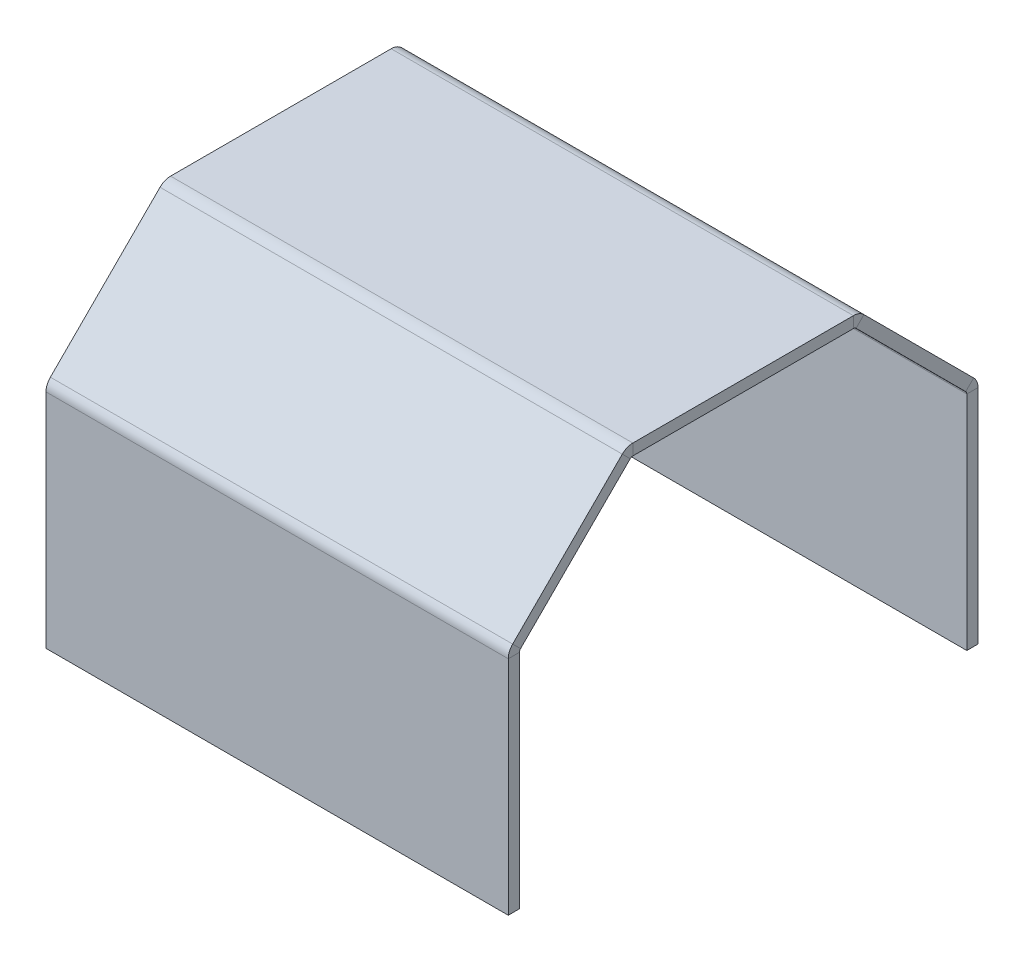
ISO-10303-21;
HEADER;
FILE_DESCRIPTION(('STEP AP214'),'2;1');
FILE_NAME('part.step','',(''),(''),'','','');
FILE_SCHEMA(('AUTOMOTIVE_DESIGN { 1 0 10303 214 1 1 1 1 }'));
ENDSEC;
DATA;
#1=APPLICATION_CONTEXT('core data for automotive mechanical design processes');
#2=APPLICATION_PROTOCOL_DEFINITION('international standard','automotive_design',2000,#1);
#3=PRODUCT_CONTEXT('',#1,'mechanical');
#4=PRODUCT('Part','Part','',(#3));
#5=PRODUCT_RELATED_PRODUCT_CATEGORY('part','',(#4));
#6=PRODUCT_DEFINITION_FORMATION('','',#4);
#7=PRODUCT_DEFINITION_CONTEXT('part definition',#1,'design');
#8=PRODUCT_DEFINITION('design','',#6,#7);
#9=PRODUCT_DEFINITION_SHAPE('','',#8);
#10=(LENGTH_UNIT() NAMED_UNIT(*) SI_UNIT(.MILLI.,.METRE.));
#11=(NAMED_UNIT(*) PLANE_ANGLE_UNIT() SI_UNIT($,.RADIAN.));
#12=(NAMED_UNIT(*) SI_UNIT($,.STERADIAN.) SOLID_ANGLE_UNIT());
#13=UNCERTAINTY_MEASURE_WITH_UNIT(LENGTH_MEASURE(1.E-05),#10,'distance_accuracy_value','');
#14=(GEOMETRIC_REPRESENTATION_CONTEXT(3) GLOBAL_UNCERTAINTY_ASSIGNED_CONTEXT((#13)) GLOBAL_UNIT_ASSIGNED_CONTEXT((#10,
#11,#12)) REPRESENTATION_CONTEXT('',''));
#15=CARTESIAN_POINT('',(0.,0.,0.));
#16=DIRECTION('',(0.,0.,1.));
#17=DIRECTION('',(1.,0.,0.));
#18=AXIS2_PLACEMENT_3D('',#15,#16,#17);
#19=CARTESIAN_POINT('',(-177.,30.1464466094067,29.8535533905933));
#20=DIRECTION('',(-1.,0.,0.));
#21=DIRECTION('',(0.,0.,1.));
#22=AXIS2_PLACEMENT_3D('',#19,#20,#21);
#23=PLANE('',#22);
#24=DIRECTION('',(0.,0.707106781186548,0.707106781186548));
#25=VECTOR('',#24,1.);
#26=CARTESIAN_POINT('',(-177.,30.1464466094067,29.8535533905933));
#27=LINE('',#26,#25);
#28=CARTESIAN_POINT('',(-177.,30.1464466094067,29.8535533905933));
#29=VERTEX_POINT('',#28);
#30=CARTESIAN_POINT('',(-177.,31.2071067811865,30.9142135623731));
#31=VERTEX_POINT('',#30);
#32=EDGE_CURVE('E11',#29,#31,#27,.T.);
#33=ORIENTED_EDGE('',*,*,#32,.F.);
#34=CARTESIAN_POINT('',(-177.,29.7928932188135,29.5));
#35=DIRECTION('',(1.,0.,0.));
#36=DIRECTION('',(0.,0.,-1.));
#37=AXIS2_PLACEMENT_3D('',#34,#35,#36);
#38=CIRCLE('',#37,0.5);
#39=CARTESIAN_POINT('',(-177.,29.7928932188135,30.));
#40=VERTEX_POINT('',#39);
#41=EDGE_CURVE('E365',#40,#29,#38,.F.);
#42=ORIENTED_EDGE('',*,*,#41,.F.);
#43=DIRECTION('',(0.,0.,-1.));
#44=VECTOR('',#43,1.);
#45=CARTESIAN_POINT('',(-177.,29.7928932188135,31.5));
#46=LINE('',#45,#44);
#47=CARTESIAN_POINT('',(-177.,29.7928932188135,31.5));
#48=VERTEX_POINT('',#47);
#49=EDGE_CURVE('E44',#48,#40,#46,.T.);
#50=ORIENTED_EDGE('',*,*,#49,.F.);
#51=CARTESIAN_POINT('',(-177.,29.7928932188135,29.5));
#52=DIRECTION('',(-1.,0.,0.));
#53=DIRECTION('',(0.,0.,1.));
#54=AXIS2_PLACEMENT_3D('',#51,#52,#53);
#55=CIRCLE('',#54,2.);
#56=EDGE_CURVE('E378',#48,#31,#55,.T.);
#57=ORIENTED_EDGE('',*,*,#56,.T.);
#58=EDGE_LOOP('',(#33,#42,#50,#57));
#59=FACE_BOUND('',#58,.T.);
#60=ADVANCED_FACE('F36',(#59),#23,.T.);
#61=CARTESIAN_POINT('',(-177.,29.7928932188135,31.5));
#62=DIRECTION('',(-1.,0.,0.));
#63=DIRECTION('',(0.,0.,1.));
#64=AXIS2_PLACEMENT_3D('',#61,#62,#63);
#65=PLANE('',#64);
#66=DIRECTION('',(0.,0.707106781186547,-0.707106781186547));
#67=VECTOR('',#66,1.);
#68=CARTESIAN_POINT('',(-177.,30.,30.));
#69=LINE('',#68,#67);
#70=CARTESIAN_POINT('',(-177.,44.8535533905933,15.1464466094067));
#71=VERTEX_POINT('',#70);
#72=EDGE_CURVE('E369',#29,#71,#69,.T.);
#73=ORIENTED_EDGE('',*,*,#72,.F.);
#74=ORIENTED_EDGE('',*,*,#32,.T.);
#75=DIRECTION('',(0.,0.707106781186548,-0.707106781186548));
#76=VECTOR('',#75,1.);
#77=CARTESIAN_POINT('',(-177.,31.0606601717798,31.0606601717798));
#78=LINE('',#77,#76);
#79=CARTESIAN_POINT('',(-177.,45.9142135623731,16.2071067811866));
#80=VERTEX_POINT('',#79);
#81=EDGE_CURVE('E380',#31,#80,#78,.T.);
#82=ORIENTED_EDGE('',*,*,#81,.T.);
#83=DIRECTION('',(0.,-0.707106781186539,-0.707106781186556));
#84=VECTOR('',#83,1.);
#85=CARTESIAN_POINT('',(-177.,45.9142135623731,16.2071067811866));
#86=LINE('',#85,#84);
#87=EDGE_CURVE('E339',#80,#71,#86,.T.);
#88=ORIENTED_EDGE('',*,*,#87,.T.);
#89=EDGE_LOOP('',(#73,#74,#82,#88));
#90=FACE_BOUND('',#89,.T.);
#91=ADVANCED_FACE('F449',(#90),#65,.T.);
#92=CARTESIAN_POINT('',(-115.,29.7928932188135,30.));
#93=DIRECTION('',(1.,0.,0.));
#94=DIRECTION('',(0.,0.,-1.));
#95=AXIS2_PLACEMENT_3D('',#92,#93,#94);
#96=PLANE('',#95);
#97=DIRECTION('',(0.,0.,1.));
#98=VECTOR('',#97,1.);
#99=CARTESIAN_POINT('',(-115.,29.7928932188135,30.));
#100=LINE('',#99,#98);
#101=CARTESIAN_POINT('',(-115.,29.7928932188135,30.));
#102=VERTEX_POINT('',#101);
#103=CARTESIAN_POINT('',(-115.,29.7928932188135,31.5));
#104=VERTEX_POINT('',#103);
#105=EDGE_CURVE('E345',#102,#104,#100,.T.);
#106=ORIENTED_EDGE('',*,*,#105,.F.);
#107=CARTESIAN_POINT('',(-115.,29.7928932188135,29.5));
#108=DIRECTION('',(1.,0.,0.));
#109=DIRECTION('',(0.,0.,-1.));
#110=AXIS2_PLACEMENT_3D('',#107,#108,#109);
#111=CIRCLE('',#110,0.5);
#112=CARTESIAN_POINT('',(-115.,30.1464466094067,29.8535533905933));
#113=VERTEX_POINT('',#112);
#114=EDGE_CURVE('E249',#102,#113,#111,.F.);
#115=ORIENTED_EDGE('',*,*,#114,.T.);
#116=DIRECTION('',(0.,-0.707106781186548,-0.707106781186548));
#117=VECTOR('',#116,1.);
#118=CARTESIAN_POINT('',(-115.,31.2071067811865,30.9142135623731));
#119=LINE('',#118,#117);
#120=CARTESIAN_POINT('',(-115.,31.2071067811865,30.9142135623731));
#121=VERTEX_POINT('',#120);
#122=EDGE_CURVE('E343',#121,#113,#119,.T.);
#123=ORIENTED_EDGE('',*,*,#122,.F.);
#124=CARTESIAN_POINT('',(-115.,29.7928932188135,29.5));
#125=DIRECTION('',(-1.,0.,0.));
#126=DIRECTION('',(0.,0.,1.));
#127=AXIS2_PLACEMENT_3D('',#124,#125,#126);
#128=CIRCLE('',#127,2.);
#129=EDGE_CURVE('E261',#104,#121,#128,.T.);
#130=ORIENTED_EDGE('',*,*,#129,.F.);
#131=EDGE_LOOP('',(#106,#115,#123,#130));
#132=FACE_BOUND('',#131,.T.);
#133=ADVANCED_FACE('F493',(#132),#96,.T.);
#134=CARTESIAN_POINT('',(-115.,31.2071067811865,30.9142135623731));
#135=DIRECTION('',(1.,0.,0.));
#136=DIRECTION('',(0.,0.,-1.));
#137=AXIS2_PLACEMENT_3D('',#134,#135,#136);
#138=PLANE('',#137);
#139=DIRECTION('',(0.,1.,0.));
#140=VECTOR('',#139,1.);
#141=CARTESIAN_POINT('',(-115.,0.,30.));
#142=LINE('',#141,#140);
#143=CARTESIAN_POINT('',(-115.,0.,30.));
#144=VERTEX_POINT('',#143);
#145=EDGE_CURVE('E252',#144,#102,#142,.T.);
#146=ORIENTED_EDGE('',*,*,#145,.T.);
#147=ORIENTED_EDGE('',*,*,#105,.T.);
#148=DIRECTION('',(0.,1.,0.));
#149=VECTOR('',#148,1.);
#150=CARTESIAN_POINT('',(-115.,0.,31.5));
#151=LINE('',#150,#149);
#152=CARTESIAN_POINT('',(-115.,0.,31.5));
#153=VERTEX_POINT('',#152);
#154=EDGE_CURVE('E258',#153,#104,#151,.T.);
#155=ORIENTED_EDGE('',*,*,#154,.F.);
#156=DIRECTION('',(0.,0.,-1.));
#157=VECTOR('',#156,1.);
#158=CARTESIAN_POINT('',(-115.,0.,31.5));
#159=LINE('',#158,#157);
#160=EDGE_CURVE('E255',#153,#144,#159,.T.);
#161=ORIENTED_EDGE('',*,*,#160,.T.);
#162=EDGE_LOOP('',(#146,#147,#155,#161));
#163=FACE_BOUND('',#162,.T.);
#164=ADVANCED_FACE('F498',(#163),#138,.T.);
#165=CARTESIAN_POINT('',(-177.,45.,14.7928932188135));
#166=DIRECTION('',(-1.,0.,0.));
#167=DIRECTION('',(0.,0.,1.));
#168=AXIS2_PLACEMENT_3D('',#165,#166,#167);
#169=PLANE('',#168);
#170=DIRECTION('',(0.,1.,0.));
#171=VECTOR('',#170,1.);
#172=CARTESIAN_POINT('',(-177.,45.,14.7928932188135));
#173=LINE('',#172,#171);
#174=CARTESIAN_POINT('',(-177.,45.,14.7928932188135));
#175=VERTEX_POINT('',#174);
#176=CARTESIAN_POINT('',(-177.,46.5,14.7928932188135));
#177=VERTEX_POINT('',#176);
#178=EDGE_CURVE('E341',#175,#177,#173,.T.);
#179=ORIENTED_EDGE('',*,*,#178,.F.);
#180=CARTESIAN_POINT('',(-177.,44.5,14.7928932188135));
#181=DIRECTION('',(1.,0.,0.));
#182=DIRECTION('',(0.,0.,-1.));
#183=AXIS2_PLACEMENT_3D('',#180,#181,#182);
#184=CIRCLE('',#183,0.5);
#185=EDGE_CURVE('E439',#71,#175,#184,.F.);
#186=ORIENTED_EDGE('',*,*,#185,.F.);
#187=ORIENTED_EDGE('',*,*,#87,.F.);
#188=CARTESIAN_POINT('',(-177.,44.5,14.7928932188135));
#189=DIRECTION('',(-1.,0.,0.));
#190=DIRECTION('',(0.,0.,1.));
#191=AXIS2_PLACEMENT_3D('',#188,#189,#190);
#192=CIRCLE('',#191,2.);
#193=EDGE_CURVE('E383',#80,#177,#192,.T.);
#194=ORIENTED_EDGE('',*,*,#193,.T.);
#195=EDGE_LOOP('',(#179,#186,#187,#194));
#196=FACE_BOUND('',#195,.T.);
#197=ADVANCED_FACE('F456',(#196),#169,.T.);
#198=CARTESIAN_POINT('',(-177.,45.9142135623731,16.2071067811866));
#199=DIRECTION('',(-1.,0.,0.));
#200=DIRECTION('',(0.,0.,1.));
#201=AXIS2_PLACEMENT_3D('',#198,#199,#200);
#202=PLANE('',#201);
#203=DIRECTION('',(0.,0.,-1.));
#204=VECTOR('',#203,1.);
#205=CARTESIAN_POINT('',(-177.,45.,15.));
#206=LINE('',#205,#204);
#207=CARTESIAN_POINT('',(-177.,45.,-14.7928932188135));
#208=VERTEX_POINT('',#207);
#209=EDGE_CURVE('E436',#175,#208,#206,.T.);
#210=ORIENTED_EDGE('',*,*,#209,.F.);
#211=ORIENTED_EDGE('',*,*,#178,.T.);
#212=DIRECTION('',(0.,0.,1.));
#213=VECTOR('',#212,1.);
#214=CARTESIAN_POINT('',(-177.,46.5,15.));
#215=LINE('',#214,#213);
#216=CARTESIAN_POINT('',(-177.,46.5,-14.7928932188135));
#217=VERTEX_POINT('',#216);
#218=EDGE_CURVE('E203',#177,#217,#215,.F.);
#219=ORIENTED_EDGE('',*,*,#218,.T.);
#220=DIRECTION('',(0.,-1.,0.));
#221=VECTOR('',#220,1.);
#222=CARTESIAN_POINT('',(-177.,46.5,-14.7928932188135));
#223=LINE('',#222,#221);
#224=EDGE_CURVE('E194',#217,#208,#223,.T.);
#225=ORIENTED_EDGE('',*,*,#224,.T.);
#226=EDGE_LOOP('',(#210,#211,#219,#225));
#227=FACE_BOUND('',#226,.T.);
#228=ADVANCED_FACE('F389',(#227),#202,.T.);
#229=CARTESIAN_POINT('',(-115.,44.8535533905933,15.1464466094067));
#230=DIRECTION('',(1.,0.,0.));
#231=DIRECTION('',(0.,0.,-1.));
#232=AXIS2_PLACEMENT_3D('',#229,#230,#231);
#233=PLANE('',#232);
#234=DIRECTION('',(0.,0.707106781186539,0.707106781186556));
#235=VECTOR('',#234,1.);
#236=CARTESIAN_POINT('',(-115.,44.8535533905933,15.1464466094067));
#237=LINE('',#236,#235);
#238=CARTESIAN_POINT('',(-115.,44.8535533905933,15.1464466094067));
#239=VERTEX_POINT('',#238);
#240=CARTESIAN_POINT('',(-115.,45.9142135623731,16.2071067811866));
#241=VERTEX_POINT('',#240);
#242=EDGE_CURVE('E337',#239,#241,#237,.T.);
#243=ORIENTED_EDGE('',*,*,#242,.F.);
#244=CARTESIAN_POINT('',(-115.,44.5,14.7928932188135));
#245=DIRECTION('',(1.,0.,0.));
#246=DIRECTION('',(0.,0.,-1.));
#247=AXIS2_PLACEMENT_3D('',#244,#245,#246);
#248=CIRCLE('',#247,0.5);
#249=CARTESIAN_POINT('',(-115.,45.,14.7928932188135));
#250=VERTEX_POINT('',#249);
#251=EDGE_CURVE('E243',#239,#250,#248,.F.);
#252=ORIENTED_EDGE('',*,*,#251,.T.);
#253=DIRECTION('',(0.,-1.,0.));
#254=VECTOR('',#253,1.);
#255=CARTESIAN_POINT('',(-115.,46.5,14.7928932188135));
#256=LINE('',#255,#254);
#257=CARTESIAN_POINT('',(-115.,46.5,14.7928932188135));
#258=VERTEX_POINT('',#257);
#259=EDGE_CURVE('E193',#258,#250,#256,.T.);
#260=ORIENTED_EDGE('',*,*,#259,.F.);
#261=CARTESIAN_POINT('',(-115.,44.5,14.7928932188135));
#262=DIRECTION('',(-1.,0.,0.));
#263=DIRECTION('',(0.,0.,1.));
#264=AXIS2_PLACEMENT_3D('',#261,#262,#263);
#265=CIRCLE('',#264,2.);
#266=EDGE_CURVE('E267',#241,#258,#265,.T.);
#267=ORIENTED_EDGE('',*,*,#266,.F.);
#268=EDGE_LOOP('',(#243,#252,#260,#267));
#269=FACE_BOUND('',#268,.T.);
#270=ADVANCED_FACE('F465',(#269),#233,.T.);
#271=CARTESIAN_POINT('',(-115.,46.5,14.7928932188135));
#272=DIRECTION('',(1.,0.,0.));
#273=DIRECTION('',(0.,0.,-1.));
#274=AXIS2_PLACEMENT_3D('',#271,#272,#273);
#275=PLANE('',#274);
#276=DIRECTION('',(0.,0.707106781186547,-0.707106781186547));
#277=VECTOR('',#276,1.);
#278=CARTESIAN_POINT('',(-115.,30.,30.));
#279=LINE('',#278,#277);
#280=EDGE_CURVE('E246',#113,#239,#279,.T.);
#281=ORIENTED_EDGE('',*,*,#280,.T.);
#282=ORIENTED_EDGE('',*,*,#242,.T.);
#283=DIRECTION('',(0.,0.707106781186548,-0.707106781186548));
#284=VECTOR('',#283,1.);
#285=CARTESIAN_POINT('',(-115.,31.0606601717798,31.0606601717798));
#286=LINE('',#285,#284);
#287=EDGE_CURVE('E264',#121,#241,#286,.T.);
#288=ORIENTED_EDGE('',*,*,#287,.F.);
#289=ORIENTED_EDGE('',*,*,#122,.T.);
#290=EDGE_LOOP('',(#281,#282,#288,#289));
#291=FACE_BOUND('',#290,.T.);
#292=ADVANCED_FACE('F469',(#291),#275,.T.);
#293=CARTESIAN_POINT('',(-177.,44.8535533905933,-15.1464466094067));
#294=DIRECTION('',(-1.,0.,0.));
#295=DIRECTION('',(0.,0.,1.));
#296=AXIS2_PLACEMENT_3D('',#293,#294,#295);
#297=PLANE('',#296);
#298=DIRECTION('',(0.,0.707106781186549,-0.707106781186546));
#299=VECTOR('',#298,1.);
#300=CARTESIAN_POINT('',(-177.,44.8535533905933,-15.1464466094067));
#301=LINE('',#300,#299);
#302=CARTESIAN_POINT('',(-177.,44.8535533905933,-15.1464466094067));
#303=VERTEX_POINT('',#302);
#304=CARTESIAN_POINT('',(-177.,45.9142135623731,-16.2071067811865));
#305=VERTEX_POINT('',#304);
#306=EDGE_CURVE('E181',#303,#305,#301,.T.);
#307=ORIENTED_EDGE('',*,*,#306,.F.);
#308=CARTESIAN_POINT('',(-177.,44.5,-14.7928932188135));
#309=DIRECTION('',(1.,0.,0.));
#310=DIRECTION('',(0.,0.,-1.));
#311=AXIS2_PLACEMENT_3D('',#308,#309,#310);
#312=CIRCLE('',#311,0.5);
#313=EDGE_CURVE('E401',#208,#303,#312,.F.);
#314=ORIENTED_EDGE('',*,*,#313,.F.);
#315=ORIENTED_EDGE('',*,*,#224,.F.);
#316=CARTESIAN_POINT('',(-177.,44.5,-14.7928932188135));
#317=DIRECTION('',(-1.,0.,0.));
#318=DIRECTION('',(0.,0.,1.));
#319=AXIS2_PLACEMENT_3D('',#316,#317,#318);
#320=CIRCLE('',#319,2.);
#321=EDGE_CURVE('E197',#217,#305,#320,.T.);
#322=ORIENTED_EDGE('',*,*,#321,.T.);
#323=EDGE_LOOP('',(#307,#314,#315,#322));
#324=FACE_BOUND('',#323,.T.);
#325=ADVANCED_FACE('F199',(#324),#297,.T.);
#326=CARTESIAN_POINT('',(-177.,46.5,-14.7928932188135));
#327=DIRECTION('',(-1.,0.,0.));
#328=DIRECTION('',(0.,0.,1.));
#329=AXIS2_PLACEMENT_3D('',#326,#327,#328);
#330=PLANE('',#329);
#331=DIRECTION('',(0.,-0.707106781186547,-0.707106781186547));
#332=VECTOR('',#331,1.);
#333=CARTESIAN_POINT('',(-177.,45.,-15.));
#334=LINE('',#333,#332);
#335=CARTESIAN_POINT('',(-177.,30.1464466094067,-29.8535533905933));
#336=VERTEX_POINT('',#335);
#337=EDGE_CURVE('E188',#303,#336,#334,.T.);
#338=ORIENTED_EDGE('',*,*,#337,.F.);
#339=ORIENTED_EDGE('',*,*,#306,.T.);
#340=DIRECTION('',(0.,-0.707106781186548,-0.707106781186548));
#341=VECTOR('',#340,1.);
#342=CARTESIAN_POINT('',(-177.,46.0606601717798,-16.0606601717798));
#343=LINE('',#342,#341);
#344=CARTESIAN_POINT('',(-177.,31.2071067811866,-30.9142135623731));
#345=VERTEX_POINT('',#344);
#346=EDGE_CURVE('E185',#305,#345,#343,.T.);
#347=ORIENTED_EDGE('',*,*,#346,.T.);
#348=DIRECTION('',(0.,-0.707106781186554,0.707106781186541));
#349=VECTOR('',#348,1.);
#350=CARTESIAN_POINT('',(-177.,31.2071067811866,-30.9142135623731));
#351=LINE('',#350,#349);
#352=EDGE_CURVE('E328',#345,#336,#351,.T.);
#353=ORIENTED_EDGE('',*,*,#352,.T.);
#354=EDGE_LOOP('',(#338,#339,#347,#353));
#355=FACE_BOUND('',#354,.T.);
#356=ADVANCED_FACE('F183',(#355),#330,.T.);
#357=CARTESIAN_POINT('',(-115.,45.,-14.7928932188135));
#358=DIRECTION('',(1.,0.,0.));
#359=DIRECTION('',(0.,0.,-1.));
#360=AXIS2_PLACEMENT_3D('',#357,#358,#359);
#361=PLANE('',#360);
#362=DIRECTION('',(0.,1.,0.));
#363=VECTOR('',#362,1.);
#364=CARTESIAN_POINT('',(-115.,45.,-14.7928932188135));
#365=LINE('',#364,#363);
#366=CARTESIAN_POINT('',(-115.,45.,-14.7928932188135));
#367=VERTEX_POINT('',#366);
#368=CARTESIAN_POINT('',(-115.,46.5,-14.7928932188135));
#369=VERTEX_POINT('',#368);
#370=EDGE_CURVE('E333',#367,#369,#365,.T.);
#371=ORIENTED_EDGE('',*,*,#370,.F.);
#372=CARTESIAN_POINT('',(-115.,44.5,-14.7928932188135));
#373=DIRECTION('',(1.,0.,0.));
#374=DIRECTION('',(0.,0.,-1.));
#375=AXIS2_PLACEMENT_3D('',#372,#373,#374);
#376=CIRCLE('',#375,0.5);
#377=CARTESIAN_POINT('',(-115.,44.8535533905933,-15.1464466094067));
#378=VERTEX_POINT('',#377);
#379=EDGE_CURVE('E237',#367,#378,#376,.F.);
#380=ORIENTED_EDGE('',*,*,#379,.T.);
#381=DIRECTION('',(0.,-0.707106781186549,0.707106781186546));
#382=VECTOR('',#381,1.);
#383=CARTESIAN_POINT('',(-115.,45.9142135623731,-16.2071067811865));
#384=LINE('',#383,#382);
#385=CARTESIAN_POINT('',(-115.,45.9142135623731,-16.2071067811865));
#386=VERTEX_POINT('',#385);
#387=EDGE_CURVE('E331',#386,#378,#384,.T.);
#388=ORIENTED_EDGE('',*,*,#387,.F.);
#389=CARTESIAN_POINT('',(-115.,44.5,-14.7928932188135));
#390=DIRECTION('',(-1.,0.,0.));
#391=DIRECTION('',(0.,0.,1.));
#392=AXIS2_PLACEMENT_3D('',#389,#390,#391);
#393=CIRCLE('',#392,2.);
#394=EDGE_CURVE('E210',#369,#386,#393,.T.);
#395=ORIENTED_EDGE('',*,*,#394,.F.);
#396=EDGE_LOOP('',(#371,#380,#388,#395));
#397=FACE_BOUND('',#396,.T.);
#398=ADVANCED_FACE('F395',(#397),#361,.T.);
#399=CARTESIAN_POINT('',(-115.,45.9142135623731,-16.2071067811865));
#400=DIRECTION('',(1.,0.,0.));
#401=DIRECTION('',(0.,0.,-1.));
#402=AXIS2_PLACEMENT_3D('',#399,#400,#401);
#403=PLANE('',#402);
#404=DIRECTION('',(0.,0.,-1.));
#405=VECTOR('',#404,1.);
#406=CARTESIAN_POINT('',(-115.,45.,15.));
#407=LINE('',#406,#405);
#408=EDGE_CURVE('E240',#250,#367,#407,.T.);
#409=ORIENTED_EDGE('',*,*,#408,.T.);
#410=ORIENTED_EDGE('',*,*,#370,.T.);
#411=DIRECTION('',(0.,0.,1.));
#412=VECTOR('',#411,1.);
#413=CARTESIAN_POINT('',(-115.,46.5,15.));
#414=LINE('',#413,#412);
#415=EDGE_CURVE('E270',#258,#369,#414,.F.);
#416=ORIENTED_EDGE('',*,*,#415,.F.);
#417=ORIENTED_EDGE('',*,*,#259,.T.);
#418=EDGE_LOOP('',(#409,#410,#416,#417));
#419=FACE_BOUND('',#418,.T.);
#420=ADVANCED_FACE('F475',(#419),#403,.T.);
#421=CARTESIAN_POINT('',(-177.,29.7928932188135,-30.));
#422=DIRECTION('',(-1.,0.,0.));
#423=DIRECTION('',(0.,0.,1.));
#424=AXIS2_PLACEMENT_3D('',#421,#422,#423);
#425=PLANE('',#424);
#426=DIRECTION('',(0.,0.,-1.));
#427=VECTOR('',#426,1.);
#428=CARTESIAN_POINT('',(-177.,29.7928932188135,-30.));
#429=LINE('',#428,#427);
#430=CARTESIAN_POINT('',(-177.,29.7928932188135,-30.));
#431=VERTEX_POINT('',#430);
#432=CARTESIAN_POINT('',(-177.,29.7928932188135,-31.5));
#433=VERTEX_POINT('',#432);
#434=EDGE_CURVE('E52',#431,#433,#429,.T.);
#435=ORIENTED_EDGE('',*,*,#434,.F.);
#436=CARTESIAN_POINT('',(-177.,29.7928932188135,-29.5));
#437=DIRECTION('',(1.,0.,0.));
#438=DIRECTION('',(0.,0.,-1.));
#439=AXIS2_PLACEMENT_3D('',#436,#437,#438);
#440=CIRCLE('',#439,0.5);
#441=EDGE_CURVE('E429',#336,#431,#440,.F.);
#442=ORIENTED_EDGE('',*,*,#441,.F.);
#443=ORIENTED_EDGE('',*,*,#352,.F.);
#444=CARTESIAN_POINT('',(-177.,29.7928932188135,-29.5));
#445=DIRECTION('',(-1.,0.,0.));
#446=DIRECTION('',(0.,0.,1.));
#447=AXIS2_PLACEMENT_3D('',#444,#445,#446);
#448=CIRCLE('',#447,2.);
#449=EDGE_CURVE('E218',#345,#433,#448,.T.);
#450=ORIENTED_EDGE('',*,*,#449,.T.);
#451=EDGE_LOOP('',(#435,#442,#443,#450));
#452=FACE_BOUND('',#451,.T.);
#453=ADVANCED_FACE('F477',(#452),#425,.T.);
#454=CARTESIAN_POINT('',(-177.,31.2071067811866,-30.9142135623731));
#455=DIRECTION('',(-1.,0.,0.));
#456=DIRECTION('',(0.,0.,1.));
#457=AXIS2_PLACEMENT_3D('',#454,#455,#456);
#458=PLANE('',#457);
#459=DIRECTION('',(0.,-1.,0.));
#460=VECTOR('',#459,1.);
#461=CARTESIAN_POINT('',(-177.,30.,-30.));
#462=LINE('',#461,#460);
#463=CARTESIAN_POINT('',(-177.,0.,-30.));
#464=VERTEX_POINT('',#463);
#465=EDGE_CURVE('E427',#431,#464,#462,.T.);
#466=ORIENTED_EDGE('',*,*,#465,.F.);
#467=ORIENTED_EDGE('',*,*,#434,.T.);
#468=DIRECTION('',(0.,1.,0.));
#469=VECTOR('',#468,1.);
#470=CARTESIAN_POINT('',(-177.,30.,-31.5));
#471=LINE('',#470,#469);
#472=CARTESIAN_POINT('',(-177.,0.,-31.5));
#473=VERTEX_POINT('',#472);
#474=EDGE_CURVE('E130',#433,#473,#471,.F.);
#475=ORIENTED_EDGE('',*,*,#474,.T.);
#476=DIRECTION('',(0.,0.,-1.));
#477=VECTOR('',#476,1.);
#478=CARTESIAN_POINT('',(-177.,0.,-30.));
#479=LINE('',#478,#477);
#480=EDGE_CURVE('E425',#464,#473,#479,.T.);
#481=ORIENTED_EDGE('',*,*,#480,.F.);
#482=EDGE_LOOP('',(#466,#467,#475,#481));
#483=FACE_BOUND('',#482,.T.);
#484=ADVANCED_FACE('F484',(#483),#458,.T.);
#485=CARTESIAN_POINT('',(-115.,30.1464466094067,-29.8535533905933));
#486=DIRECTION('',(1.,0.,0.));
#487=DIRECTION('',(0.,0.,-1.));
#488=AXIS2_PLACEMENT_3D('',#485,#486,#487);
#489=PLANE('',#488);
#490=DIRECTION('',(0.,0.707106781186554,-0.707106781186541));
#491=VECTOR('',#490,1.);
#492=CARTESIAN_POINT('',(-115.,30.1464466094067,-29.8535533905933));
#493=LINE('',#492,#491);
#494=CARTESIAN_POINT('',(-115.,30.1464466094067,-29.8535533905933));
#495=VERTEX_POINT('',#494);
#496=CARTESIAN_POINT('',(-115.,31.2071067811866,-30.9142135623731));
#497=VERTEX_POINT('',#496);
#498=EDGE_CURVE('E117',#495,#497,#493,.T.);
#499=ORIENTED_EDGE('',*,*,#498,.F.);
#500=CARTESIAN_POINT('',(-115.,29.7928932188135,-29.5));
#501=DIRECTION('',(1.,0.,0.));
#502=DIRECTION('',(0.,0.,-1.));
#503=AXIS2_PLACEMENT_3D('',#500,#501,#502);
#504=CIRCLE('',#503,0.5);
#505=CARTESIAN_POINT('',(-115.,29.7928932188135,-30.));
#506=VERTEX_POINT('',#505);
#507=EDGE_CURVE('E233',#495,#506,#504,.F.);
#508=ORIENTED_EDGE('',*,*,#507,.T.);
#509=DIRECTION('',(0.,0.,1.));
#510=VECTOR('',#509,1.);
#511=CARTESIAN_POINT('',(-115.,29.7928932188135,-31.5));
#512=LINE('',#511,#510);
#513=CARTESIAN_POINT('',(-115.,29.7928932188135,-31.5));
#514=VERTEX_POINT('',#513);
#515=EDGE_CURVE('E124',#514,#506,#512,.T.);
#516=ORIENTED_EDGE('',*,*,#515,.F.);
#517=CARTESIAN_POINT('',(-115.,29.7928932188135,-29.5));
#518=DIRECTION('',(-1.,0.,0.));
#519=DIRECTION('',(0.,0.,1.));
#520=AXIS2_PLACEMENT_3D('',#517,#518,#519);
#521=CIRCLE('',#520,2.);
#522=EDGE_CURVE('E276',#497,#514,#521,.T.);
#523=ORIENTED_EDGE('',*,*,#522,.F.);
#524=EDGE_LOOP('',(#499,#508,#516,#523));
#525=FACE_BOUND('',#524,.T.);
#526=ADVANCED_FACE('F412',(#525),#489,.T.);
#527=CARTESIAN_POINT('',(-115.,29.7928932188135,-31.5));
#528=DIRECTION('',(1.,0.,0.));
#529=DIRECTION('',(0.,0.,-1.));
#530=AXIS2_PLACEMENT_3D('',#527,#528,#529);
#531=PLANE('',#530);
#532=DIRECTION('',(0.,-0.707106781186547,-0.707106781186547));
#533=VECTOR('',#532,1.);
#534=CARTESIAN_POINT('',(-115.,45.,-15.));
#535=LINE('',#534,#533);
#536=EDGE_CURVE('E235',#378,#495,#535,.T.);
#537=ORIENTED_EDGE('',*,*,#536,.T.);
#538=ORIENTED_EDGE('',*,*,#498,.T.);
#539=DIRECTION('',(0.,-0.707106781186548,-0.707106781186548));
#540=VECTOR('',#539,1.);
#541=CARTESIAN_POINT('',(-115.,46.0606601717798,-16.0606601717798));
#542=LINE('',#541,#540);
#543=EDGE_CURVE('E274',#386,#497,#542,.T.);
#544=ORIENTED_EDGE('',*,*,#543,.F.);
#545=ORIENTED_EDGE('',*,*,#387,.T.);
#546=EDGE_LOOP('',(#537,#538,#544,#545));
#547=FACE_BOUND('',#546,.T.);
#548=ADVANCED_FACE('F397',(#547),#531,.T.);
#549=CARTESIAN_POINT('',(-177.,30.,-31.5));
#550=DIRECTION('',(0.,0.,1.));
#551=DIRECTION('',(1.,0.,0.));
#552=AXIS2_PLACEMENT_3D('',#549,#550,#551);
#553=PLANE('',#552);
#554=DIRECTION('',(0.,1.,0.));
#555=VECTOR('',#554,1.);
#556=CARTESIAN_POINT('',(-115.,30.,-31.5));
#557=LINE('',#556,#555);
#558=CARTESIAN_POINT('',(-115.,0.,-31.5));
#559=VERTEX_POINT('',#558);
#560=EDGE_CURVE('E224',#514,#559,#557,.F.);
#561=ORIENTED_EDGE('',*,*,#560,.T.);
#562=DIRECTION('',(1.,0.,0.));
#563=VECTOR('',#562,1.);
#564=CARTESIAN_POINT('',(-177.,0.,-31.5));
#565=LINE('',#564,#563);
#566=EDGE_CURVE('E324',#473,#559,#565,.T.);
#567=ORIENTED_EDGE('',*,*,#566,.F.);
#568=ORIENTED_EDGE('',*,*,#474,.F.);
#569=DIRECTION('',(1.,0.,0.));
#570=VECTOR('',#569,1.);
#571=CARTESIAN_POINT('',(-177.,29.7928932188135,-31.5));
#572=LINE('',#571,#570);
#573=EDGE_CURVE('E220',#433,#514,#572,.T.);
#574=ORIENTED_EDGE('',*,*,#573,.T.);
#575=EDGE_LOOP('',(#561,#567,#568,#574));
#576=FACE_BOUND('',#575,.T.);
#577=ADVANCED_FACE('F418',(#576),#553,.F.);
#578=CARTESIAN_POINT('',(-177.,0.,-30.));
#579=DIRECTION('',(0.,-1.,0.));
#580=DIRECTION('',(0.,0.,-1.));
#581=AXIS2_PLACEMENT_3D('',#578,#579,#580);
#582=PLANE('',#581);
#583=DIRECTION('',(0.,0.,-1.));
#584=VECTOR('',#583,1.);
#585=CARTESIAN_POINT('',(-115.,0.,-30.));
#586=LINE('',#585,#584);
#587=CARTESIAN_POINT('',(-115.,0.,-30.));
#588=VERTEX_POINT('',#587);
#589=EDGE_CURVE('E227',#588,#559,#586,.T.);
#590=ORIENTED_EDGE('',*,*,#589,.F.);
#591=DIRECTION('',(1.,0.,0.));
#592=VECTOR('',#591,1.);
#593=CARTESIAN_POINT('',(-177.,0.,-30.));
#594=LINE('',#593,#592);
#595=EDGE_CURVE('E322',#464,#588,#594,.T.);
#596=ORIENTED_EDGE('',*,*,#595,.F.);
#597=ORIENTED_EDGE('',*,*,#480,.T.);
#598=ORIENTED_EDGE('',*,*,#566,.T.);
#599=EDGE_LOOP('',(#590,#596,#597,#598));
#600=FACE_BOUND('',#599,.T.);
#601=ADVANCED_FACE('F423',(#600),#582,.T.);
#602=CARTESIAN_POINT('',(-177.,30.,-30.));
#603=DIRECTION('',(0.,0.,1.));
#604=DIRECTION('',(1.,0.,0.));
#605=AXIS2_PLACEMENT_3D('',#602,#603,#604);
#606=PLANE('',#605);
#607=DIRECTION('',(0.,-1.,0.));
#608=VECTOR('',#607,1.);
#609=CARTESIAN_POINT('',(-115.,30.,-30.));
#610=LINE('',#609,#608);
#611=EDGE_CURVE('E230',#506,#588,#610,.T.);
#612=ORIENTED_EDGE('',*,*,#611,.F.);
#613=DIRECTION('',(1.,0.,0.));
#614=VECTOR('',#613,1.);
#615=CARTESIAN_POINT('',(-177.,29.7928932188135,-30.));
#616=LINE('',#615,#614);
#617=EDGE_CURVE('E319',#431,#506,#616,.T.);
#618=ORIENTED_EDGE('',*,*,#617,.F.);
#619=ORIENTED_EDGE('',*,*,#465,.T.);
#620=ORIENTED_EDGE('',*,*,#595,.T.);
#621=EDGE_LOOP('',(#612,#618,#619,#620));
#622=FACE_BOUND('',#621,.T.);
#623=ADVANCED_FACE('F631',(#622),#606,.T.);
#624=CARTESIAN_POINT('',(-177.,29.7928932188135,-29.5));
#625=DIRECTION('',(1.,0.,0.));
#626=DIRECTION('',(0.,0.,-1.));
#627=AXIS2_PLACEMENT_3D('',#624,#625,#626);
#628=CYLINDRICAL_SURFACE('',#627,0.5);
#629=ORIENTED_EDGE('',*,*,#507,.F.);
#630=DIRECTION('',(1.,0.,0.));
#631=VECTOR('',#630,1.);
#632=CARTESIAN_POINT('',(-177.,30.1464466094067,-29.8535533905933));
#633=LINE('',#632,#631);
#634=EDGE_CURVE('E316',#336,#495,#633,.T.);
#635=ORIENTED_EDGE('',*,*,#634,.F.);
#636=ORIENTED_EDGE('',*,*,#441,.T.);
#637=ORIENTED_EDGE('',*,*,#617,.T.);
#638=EDGE_LOOP('',(#629,#635,#636,#637));
#639=FACE_BOUND('',#638,.T.);
#640=ADVANCED_FACE('F409',(#639),#628,.F.);
#641=CARTESIAN_POINT('',(-177.,45.,-15.));
#642=DIRECTION('',(0.,-0.707106781186548,0.707106781186548));
#643=DIRECTION('',(0.,-0.707106781186548,-0.707106781186548));
#644=AXIS2_PLACEMENT_3D('',#641,#642,#643);
#645=PLANE('',#644);
#646=ORIENTED_EDGE('',*,*,#536,.F.);
#647=DIRECTION('',(1.,0.,0.));
#648=VECTOR('',#647,1.);
#649=CARTESIAN_POINT('',(-177.,44.8535533905933,-15.1464466094067));
#650=LINE('',#649,#648);
#651=EDGE_CURVE('E313',#303,#378,#650,.T.);
#652=ORIENTED_EDGE('',*,*,#651,.F.);
#653=ORIENTED_EDGE('',*,*,#337,.T.);
#654=ORIENTED_EDGE('',*,*,#634,.T.);
#655=EDGE_LOOP('',(#646,#652,#653,#654));
#656=FACE_BOUND('',#655,.T.);
#657=ADVANCED_FACE('F403',(#656),#645,.T.);
#658=CARTESIAN_POINT('',(-177.,44.5,-14.7928932188135));
#659=DIRECTION('',(1.,0.,0.));
#660=DIRECTION('',(0.,0.,-1.));
#661=AXIS2_PLACEMENT_3D('',#658,#659,#660);
#662=CYLINDRICAL_SURFACE('',#661,0.5);
#663=ORIENTED_EDGE('',*,*,#379,.F.);
#664=DIRECTION('',(1.,0.,0.));
#665=VECTOR('',#664,1.);
#666=CARTESIAN_POINT('',(-177.,45.,-14.7928932188135));
#667=LINE('',#666,#665);
#668=EDGE_CURVE('E310',#208,#367,#667,.T.);
#669=ORIENTED_EDGE('',*,*,#668,.F.);
#670=ORIENTED_EDGE('',*,*,#313,.T.);
#671=ORIENTED_EDGE('',*,*,#651,.T.);
#672=EDGE_LOOP('',(#663,#669,#670,#671));
#673=FACE_BOUND('',#672,.T.);
#674=ADVANCED_FACE('F400',(#673),#662,.F.);
#675=CARTESIAN_POINT('',(-177.,45.,15.));
#676=DIRECTION('',(0.,-1.,0.));
#677=DIRECTION('',(0.,0.,-1.));
#678=AXIS2_PLACEMENT_3D('',#675,#676,#677);
#679=PLANE('',#678);
#680=ORIENTED_EDGE('',*,*,#408,.F.);
#681=DIRECTION('',(1.,0.,0.));
#682=VECTOR('',#681,1.);
#683=CARTESIAN_POINT('',(-177.,45.,14.7928932188135));
#684=LINE('',#683,#682);
#685=EDGE_CURVE('E307',#175,#250,#684,.T.);
#686=ORIENTED_EDGE('',*,*,#685,.F.);
#687=ORIENTED_EDGE('',*,*,#209,.T.);
#688=ORIENTED_EDGE('',*,*,#668,.T.);
#689=EDGE_LOOP('',(#680,#686,#687,#688));
#690=FACE_BOUND('',#689,.T.);
#691=ADVANCED_FACE('F462',(#690),#679,.T.);
#692=CARTESIAN_POINT('',(-177.,44.5,14.7928932188135));
#693=DIRECTION('',(1.,0.,0.));
#694=DIRECTION('',(0.,0.,-1.));
#695=AXIS2_PLACEMENT_3D('',#692,#693,#694);
#696=CYLINDRICAL_SURFACE('',#695,0.5);
#697=ORIENTED_EDGE('',*,*,#251,.F.);
#698=DIRECTION('',(1.,0.,0.));
#699=VECTOR('',#698,1.);
#700=CARTESIAN_POINT('',(-177.,44.8535533905933,15.1464466094067));
#701=LINE('',#700,#699);
#702=EDGE_CURVE('E304',#71,#239,#701,.T.);
#703=ORIENTED_EDGE('',*,*,#702,.F.);
#704=ORIENTED_EDGE('',*,*,#185,.T.);
#705=ORIENTED_EDGE('',*,*,#685,.T.);
#706=EDGE_LOOP('',(#697,#703,#704,#705));
#707=FACE_BOUND('',#706,.T.);
#708=ADVANCED_FACE('F455',(#707),#696,.F.);
#709=CARTESIAN_POINT('',(-177.,30.,30.));
#710=DIRECTION('',(0.,-0.707106781186548,-0.707106781186548));
#711=DIRECTION('',(0.,0.707106781186548,-0.707106781186548));
#712=AXIS2_PLACEMENT_3D('',#709,#710,#711);
#713=PLANE('',#712);
#714=ORIENTED_EDGE('',*,*,#280,.F.);
#715=DIRECTION('',(1.,0.,0.));
#716=VECTOR('',#715,1.);
#717=CARTESIAN_POINT('',(-177.,30.1464466094067,29.8535533905933));
#718=LINE('',#717,#716);
#719=EDGE_CURVE('E301',#29,#113,#718,.T.);
#720=ORIENTED_EDGE('',*,*,#719,.F.);
#721=ORIENTED_EDGE('',*,*,#72,.T.);
#722=ORIENTED_EDGE('',*,*,#702,.T.);
#723=EDGE_LOOP('',(#714,#720,#721,#722));
#724=FACE_BOUND('',#723,.T.);
#725=ADVANCED_FACE('F445',(#724),#713,.T.);
#726=CARTESIAN_POINT('',(-177.,29.7928932188135,29.5));
#727=DIRECTION('',(1.,0.,0.));
#728=DIRECTION('',(0.,0.,-1.));
#729=AXIS2_PLACEMENT_3D('',#726,#727,#728);
#730=CYLINDRICAL_SURFACE('',#729,0.5);
#731=ORIENTED_EDGE('',*,*,#114,.F.);
#732=DIRECTION('',(1.,0.,0.));
#733=VECTOR('',#732,1.);
#734=CARTESIAN_POINT('',(-177.,29.7928932188135,30.));
#735=LINE('',#734,#733);
#736=EDGE_CURVE('E298',#40,#102,#735,.T.);
#737=ORIENTED_EDGE('',*,*,#736,.F.);
#738=ORIENTED_EDGE('',*,*,#41,.T.);
#739=ORIENTED_EDGE('',*,*,#719,.T.);
#740=EDGE_LOOP('',(#731,#737,#738,#739));
#741=FACE_BOUND('',#740,.T.);
#742=ADVANCED_FACE('F364',(#741),#730,.F.);
#743=CARTESIAN_POINT('',(-177.,0.,30.));
#744=DIRECTION('',(0.,0.,-1.));
#745=DIRECTION('',(0.,1.,0.));
#746=AXIS2_PLACEMENT_3D('',#743,#744,#745);
#747=PLANE('',#746);
#748=ORIENTED_EDGE('',*,*,#145,.F.);
#749=DIRECTION('',(1.,0.,0.));
#750=VECTOR('',#749,1.);
#751=CARTESIAN_POINT('',(-177.,0.,30.));
#752=LINE('',#751,#750);
#753=CARTESIAN_POINT('',(-177.,0.,30.));
#754=VERTEX_POINT('',#753);
#755=EDGE_CURVE('E296',#754,#144,#752,.T.);
#756=ORIENTED_EDGE('',*,*,#755,.F.);
#757=DIRECTION('',(0.,1.,0.));
#758=VECTOR('',#757,1.);
#759=CARTESIAN_POINT('',(-177.,0.,30.));
#760=LINE('',#759,#758);
#761=EDGE_CURVE('E353',#754,#40,#760,.T.);
#762=ORIENTED_EDGE('',*,*,#761,.T.);
#763=ORIENTED_EDGE('',*,*,#736,.T.);
#764=EDGE_LOOP('',(#748,#756,#762,#763));
#765=FACE_BOUND('',#764,.T.);
#766=ADVANCED_FACE('F371',(#765),#747,.T.);
#767=CARTESIAN_POINT('',(-177.,0.,31.5));
#768=DIRECTION('',(0.,-1.,0.));
#769=DIRECTION('',(0.,0.,-1.));
#770=AXIS2_PLACEMENT_3D('',#767,#768,#769);
#771=PLANE('',#770);
#772=ORIENTED_EDGE('',*,*,#160,.F.);
#773=DIRECTION('',(1.,0.,0.));
#774=VECTOR('',#773,1.);
#775=CARTESIAN_POINT('',(-177.,0.,31.5));
#776=LINE('',#775,#774);
#777=CARTESIAN_POINT('',(-177.,0.,31.5));
#778=VERTEX_POINT('',#777);
#779=EDGE_CURVE('E294',#778,#153,#776,.T.);
#780=ORIENTED_EDGE('',*,*,#779,.F.);
#781=DIRECTION('',(0.,0.,-1.));
#782=VECTOR('',#781,1.);
#783=CARTESIAN_POINT('',(-177.,0.,31.5));
#784=LINE('',#783,#782);
#785=EDGE_CURVE('E372',#778,#754,#784,.T.);
#786=ORIENTED_EDGE('',*,*,#785,.T.);
#787=ORIENTED_EDGE('',*,*,#755,.T.);
#788=EDGE_LOOP('',(#772,#780,#786,#787));
#789=FACE_BOUND('',#788,.T.);
#790=ADVANCED_FACE('F705',(#789),#771,.T.);
#791=CARTESIAN_POINT('',(-177.,0.,31.5));
#792=DIRECTION('',(0.,0.,-1.));
#793=DIRECTION('',(0.,1.,0.));
#794=AXIS2_PLACEMENT_3D('',#791,#792,#793);
#795=PLANE('',#794);
#796=ORIENTED_EDGE('',*,*,#154,.T.);
#797=DIRECTION('',(1.,0.,0.));
#798=VECTOR('',#797,1.);
#799=CARTESIAN_POINT('',(-177.,29.7928932188135,31.5));
#800=LINE('',#799,#798);
#801=EDGE_CURVE('E291',#48,#104,#800,.T.);
#802=ORIENTED_EDGE('',*,*,#801,.F.);
#803=DIRECTION('',(0.,1.,0.));
#804=VECTOR('',#803,1.);
#805=CARTESIAN_POINT('',(-177.,0.,31.5));
#806=LINE('',#805,#804);
#807=EDGE_CURVE('E356',#778,#48,#806,.T.);
#808=ORIENTED_EDGE('',*,*,#807,.F.);
#809=ORIENTED_EDGE('',*,*,#779,.T.);
#810=EDGE_LOOP('',(#796,#802,#808,#809));
#811=FACE_BOUND('',#810,.T.);
#812=ADVANCED_FACE('F714',(#811),#795,.F.);
#813=CARTESIAN_POINT('',(-177.,29.7928932188135,29.5));
#814=DIRECTION('',(1.,0.,0.));
#815=DIRECTION('',(0.,0.,-1.));
#816=AXIS2_PLACEMENT_3D('',#813,#814,#815);
#817=CYLINDRICAL_SURFACE('',#816,2.);
#818=ORIENTED_EDGE('',*,*,#129,.T.);
#819=DIRECTION('',(1.,0.,0.));
#820=VECTOR('',#819,1.);
#821=CARTESIAN_POINT('',(-177.,31.2071067811865,30.9142135623731));
#822=LINE('',#821,#820);
#823=EDGE_CURVE('E288',#31,#121,#822,.T.);
#824=ORIENTED_EDGE('',*,*,#823,.F.);
#825=ORIENTED_EDGE('',*,*,#56,.F.);
#826=ORIENTED_EDGE('',*,*,#801,.T.);
#827=EDGE_LOOP('',(#818,#824,#825,#826));
#828=FACE_BOUND('',#827,.T.);
#829=ADVANCED_FACE('F724',(#828),#817,.T.);
#830=CARTESIAN_POINT('',(-177.,31.0606601717798,31.0606601717798));
#831=DIRECTION('',(0.,-0.707106781186548,-0.707106781186548));
#832=DIRECTION('',(0.,0.707106781186548,-0.707106781186548));
#833=AXIS2_PLACEMENT_3D('',#830,#831,#832);
#834=PLANE('',#833);
#835=ORIENTED_EDGE('',*,*,#287,.T.);
#836=DIRECTION('',(1.,0.,0.));
#837=VECTOR('',#836,1.);
#838=CARTESIAN_POINT('',(-177.,45.9142135623731,16.2071067811866));
#839=LINE('',#838,#837);
#840=EDGE_CURVE('E285',#80,#241,#839,.T.);
#841=ORIENTED_EDGE('',*,*,#840,.F.);
#842=ORIENTED_EDGE('',*,*,#81,.F.);
#843=ORIENTED_EDGE('',*,*,#823,.T.);
#844=EDGE_LOOP('',(#835,#841,#842,#843));
#845=FACE_BOUND('',#844,.T.);
#846=ADVANCED_FACE('F471',(#845),#834,.F.);
#847=CARTESIAN_POINT('',(-177.,44.5,14.7928932188135));
#848=DIRECTION('',(1.,0.,0.));
#849=DIRECTION('',(0.,0.,-1.));
#850=AXIS2_PLACEMENT_3D('',#847,#848,#849);
#851=CYLINDRICAL_SURFACE('',#850,2.);
#852=ORIENTED_EDGE('',*,*,#266,.T.);
#853=DIRECTION('',(1.,0.,0.));
#854=VECTOR('',#853,1.);
#855=CARTESIAN_POINT('',(-177.,46.5,14.7928932188135));
#856=LINE('',#855,#854);
#857=EDGE_CURVE('E282',#177,#258,#856,.T.);
#858=ORIENTED_EDGE('',*,*,#857,.F.);
#859=ORIENTED_EDGE('',*,*,#193,.F.);
#860=ORIENTED_EDGE('',*,*,#840,.T.);
#861=EDGE_LOOP('',(#852,#858,#859,#860));
#862=FACE_BOUND('',#861,.T.);
#863=ADVANCED_FACE('F474',(#862),#851,.T.);
#864=CARTESIAN_POINT('',(-177.,46.5,15.));
#865=DIRECTION('',(0.,-1.,0.));
#866=DIRECTION('',(0.,0.,-1.));
#867=AXIS2_PLACEMENT_3D('',#864,#865,#866);
#868=PLANE('',#867);
#869=ORIENTED_EDGE('',*,*,#415,.T.);
#870=DIRECTION('',(1.,0.,0.));
#871=VECTOR('',#870,1.);
#872=CARTESIAN_POINT('',(-177.,46.5,-14.7928932188135));
#873=LINE('',#872,#871);
#874=EDGE_CURVE('E212',#217,#369,#873,.T.);
#875=ORIENTED_EDGE('',*,*,#874,.F.);
#876=ORIENTED_EDGE('',*,*,#218,.F.);
#877=ORIENTED_EDGE('',*,*,#857,.T.);
#878=EDGE_LOOP('',(#869,#875,#876,#877));
#879=FACE_BOUND('',#878,.T.);
#880=ADVANCED_FACE('F392',(#879),#868,.F.);
#881=CARTESIAN_POINT('',(-177.,44.5,-14.7928932188135));
#882=DIRECTION('',(1.,0.,0.));
#883=DIRECTION('',(0.,0.,-1.));
#884=AXIS2_PLACEMENT_3D('',#881,#882,#883);
#885=CYLINDRICAL_SURFACE('',#884,2.);
#886=ORIENTED_EDGE('',*,*,#394,.T.);
#887=DIRECTION('',(1.,0.,0.));
#888=VECTOR('',#887,1.);
#889=CARTESIAN_POINT('',(-177.,45.9142135623731,-16.2071067811865));
#890=LINE('',#889,#888);
#891=EDGE_CURVE('E207',#305,#386,#890,.T.);
#892=ORIENTED_EDGE('',*,*,#891,.F.);
#893=ORIENTED_EDGE('',*,*,#321,.F.);
#894=ORIENTED_EDGE('',*,*,#874,.T.);
#895=EDGE_LOOP('',(#886,#892,#893,#894));
#896=FACE_BOUND('',#895,.T.);
#897=ADVANCED_FACE('F208',(#896),#885,.T.);
#898=CARTESIAN_POINT('',(-177.,46.0606601717798,-16.0606601717798));
#899=DIRECTION('',(0.,-0.707106781186548,0.707106781186548));
#900=DIRECTION('',(0.,-0.707106781186548,-0.707106781186548));
#901=AXIS2_PLACEMENT_3D('',#898,#899,#900);
#902=PLANE('',#901);
#903=ORIENTED_EDGE('',*,*,#543,.T.);
#904=DIRECTION('',(1.,0.,0.));
#905=VECTOR('',#904,1.);
#906=CARTESIAN_POINT('',(-177.,31.2071067811866,-30.9142135623731));
#907=LINE('',#906,#905);
#908=EDGE_CURVE('E213',#345,#497,#907,.T.);
#909=ORIENTED_EDGE('',*,*,#908,.F.);
#910=ORIENTED_EDGE('',*,*,#346,.F.);
#911=ORIENTED_EDGE('',*,*,#891,.T.);
#912=EDGE_LOOP('',(#903,#909,#910,#911));
#913=FACE_BOUND('',#912,.T.);
#914=ADVANCED_FACE('F215',(#913),#902,.F.);
#915=CARTESIAN_POINT('',(-177.,29.7928932188135,-29.5));
#916=DIRECTION('',(1.,0.,0.));
#917=DIRECTION('',(0.,0.,-1.));
#918=AXIS2_PLACEMENT_3D('',#915,#916,#917);
#919=CYLINDRICAL_SURFACE('',#918,2.);
#920=ORIENTED_EDGE('',*,*,#522,.T.);
#921=ORIENTED_EDGE('',*,*,#573,.F.);
#922=ORIENTED_EDGE('',*,*,#449,.F.);
#923=ORIENTED_EDGE('',*,*,#908,.T.);
#924=EDGE_LOOP('',(#920,#921,#922,#923));
#925=FACE_BOUND('',#924,.T.);
#926=ADVANCED_FACE('F415',(#925),#919,.T.);
#927=CARTESIAN_POINT('',(-177.,29.7928932188135,-29.5));
#928=DIRECTION('',(1.,0.,0.));
#929=DIRECTION('',(0.,0.,-1.));
#930=AXIS2_PLACEMENT_3D('',#927,#928,#929);
#931=PLANE('',#930);
#932=ORIENTED_EDGE('',*,*,#807,.T.);
#933=ORIENTED_EDGE('',*,*,#49,.T.);
#934=ORIENTED_EDGE('',*,*,#761,.F.);
#935=ORIENTED_EDGE('',*,*,#785,.F.);
#936=EDGE_LOOP('',(#932,#933,#934,#935));
#937=FACE_BOUND('',#936,.T.);
#938=ADVANCED_FACE('F350',(#937),#931,.F.);
#939=CARTESIAN_POINT('',(-115.,29.7928932188135,-29.5));
#940=DIRECTION('',(1.,0.,0.));
#941=DIRECTION('',(0.,0.,-1.));
#942=AXIS2_PLACEMENT_3D('',#939,#940,#941);
#943=PLANE('',#942);
#944=ORIENTED_EDGE('',*,*,#560,.F.);
#945=ORIENTED_EDGE('',*,*,#515,.T.);
#946=ORIENTED_EDGE('',*,*,#611,.T.);
#947=ORIENTED_EDGE('',*,*,#589,.T.);
#948=EDGE_LOOP('',(#944,#945,#946,#947));
#949=FACE_BOUND('',#948,.T.);
#950=ADVANCED_FACE('F420',(#949),#943,.T.);
#951=CLOSED_SHELL('',(#60,#91,#133,#164,#197,#228,#270,#292,#325,#356,#398,#420,#453,#484,#526,
#548,#577,#601,#623,#640,#657,#674,#691,#708,#725,#742,#766,#790,#812,#829,#846,#863,#880,#897,
#914,#926,#938,#950));
#952=MANIFOLD_SOLID_BREP('B2',#951);
#953=ADVANCED_BREP_SHAPE_REPRESENTATION('',(#18,#952),#14);
#954=SHAPE_DEFINITION_REPRESENTATION(#9,#953);
ENDSEC;
END-ISO-10303-21;
